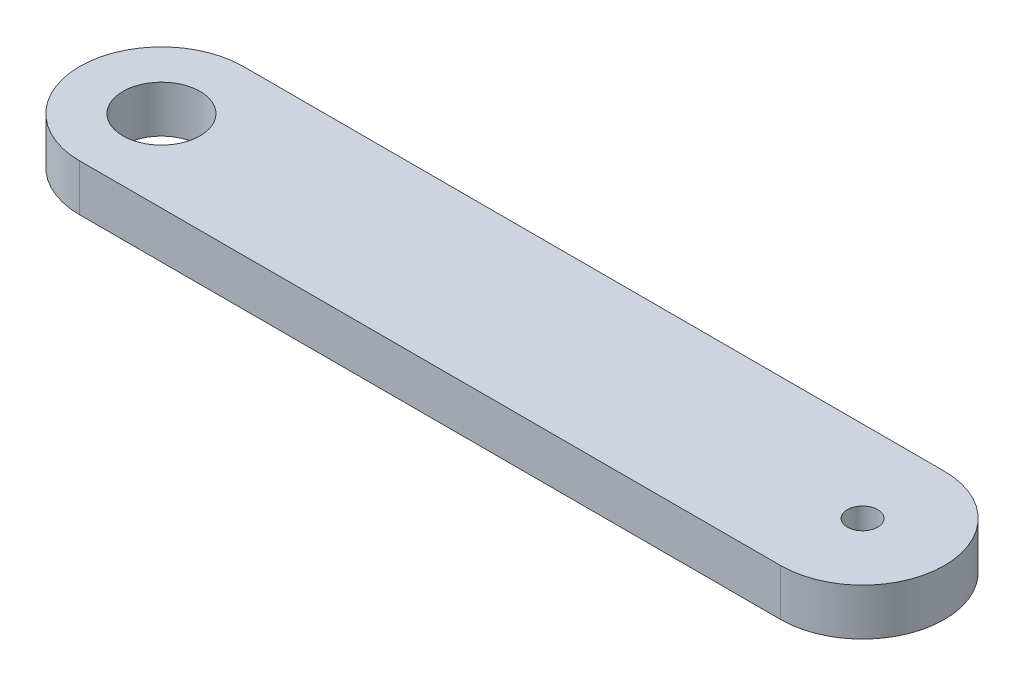
ISO-10303-21;
HEADER;
FILE_DESCRIPTION(('STEP AP214'),'2;1');
FILE_NAME('part.step','',(''),(''),'','','');
FILE_SCHEMA(('AUTOMOTIVE_DESIGN { 1 0 10303 214 1 1 1 1 }'));
ENDSEC;
DATA;
#1=APPLICATION_CONTEXT('core data for automotive mechanical design processes');
#2=APPLICATION_PROTOCOL_DEFINITION('international standard','automotive_design',2000,#1);
#3=PRODUCT_CONTEXT('',#1,'mechanical');
#4=PRODUCT('Part','Part','',(#3));
#5=PRODUCT_RELATED_PRODUCT_CATEGORY('part','',(#4));
#6=PRODUCT_DEFINITION_FORMATION('','',#4);
#7=PRODUCT_DEFINITION_CONTEXT('part definition',#1,'design');
#8=PRODUCT_DEFINITION('design','',#6,#7);
#9=PRODUCT_DEFINITION_SHAPE('','',#8);
#10=(LENGTH_UNIT() NAMED_UNIT(*) SI_UNIT(.MILLI.,.METRE.));
#11=(NAMED_UNIT(*) PLANE_ANGLE_UNIT() SI_UNIT($,.RADIAN.));
#12=(NAMED_UNIT(*) SI_UNIT($,.STERADIAN.) SOLID_ANGLE_UNIT());
#13=UNCERTAINTY_MEASURE_WITH_UNIT(LENGTH_MEASURE(1.E-05),#10,'distance_accuracy_value','');
#14=(GEOMETRIC_REPRESENTATION_CONTEXT(3) GLOBAL_UNCERTAINTY_ASSIGNED_CONTEXT((#13)) GLOBAL_UNIT_ASSIGNED_CONTEXT((#10,
#11,#12)) REPRESENTATION_CONTEXT('',''));
#15=CARTESIAN_POINT('',(0.,0.,0.));
#16=DIRECTION('',(0.,0.,1.));
#17=DIRECTION('',(1.,0.,0.));
#18=AXIS2_PLACEMENT_3D('',#15,#16,#17);
#19=CARTESIAN_POINT('',(0.,10.,0.));
#20=DIRECTION('',(0.,1.,0.));
#21=DIRECTION('',(0.,0.,1.));
#22=AXIS2_PLACEMENT_3D('',#19,#20,#21);
#23=PLANE('',#22);
#24=CARTESIAN_POINT('',(0.,10.,0.));
#25=DIRECTION('',(0.,1.,0.));
#26=DIRECTION('',(0.,0.,1.));
#27=AXIS2_PLACEMENT_3D('',#24,#25,#26);
#28=CIRCLE('',#27,8.25);
#29=CARTESIAN_POINT('',(0.,10.,8.25));
#30=VERTEX_POINT('',#29);
#31=EDGE_CURVE('E103',#30,#30,#28,.T.);
#32=ORIENTED_EDGE('',*,*,#31,.F.);
#33=EDGE_LOOP('',(#32));
#34=FACE_BOUND('',#33,.T.);
#35=CARTESIAN_POINT('',(0.,10.,0.));
#36=DIRECTION('',(0.,1.,0.));
#37=DIRECTION('',(0.,0.,1.));
#38=AXIS2_PLACEMENT_3D('',#35,#36,#37);
#39=CIRCLE('',#38,17.5);
#40=CARTESIAN_POINT('',(0.,10.,-17.5));
#41=VERTEX_POINT('',#40);
#42=CARTESIAN_POINT('',(0.,10.,17.5));
#43=VERTEX_POINT('',#42);
#44=EDGE_CURVE('E88',#41,#43,#39,.T.);
#45=ORIENTED_EDGE('',*,*,#44,.T.);
#46=DIRECTION('',(1.,0.,0.));
#47=VECTOR('',#46,1.);
#48=CARTESIAN_POINT('',(0.,10.,17.5));
#49=LINE('',#48,#47);
#50=CARTESIAN_POINT('',(150.,10.,17.5));
#51=VERTEX_POINT('',#50);
#52=EDGE_CURVE('E83',#43,#51,#49,.T.);
#53=ORIENTED_EDGE('',*,*,#52,.T.);
#54=CARTESIAN_POINT('',(150.,10.,0.));
#55=DIRECTION('',(0.,1.,0.));
#56=DIRECTION('',(0.,0.,1.));
#57=AXIS2_PLACEMENT_3D('',#54,#55,#56);
#58=CIRCLE('',#57,17.5);
#59=CARTESIAN_POINT('',(150.,10.,-17.5));
#60=VERTEX_POINT('',#59);
#61=EDGE_CURVE('E86',#51,#60,#58,.T.);
#62=ORIENTED_EDGE('',*,*,#61,.T.);
#63=DIRECTION('',(-1.,0.,0.));
#64=VECTOR('',#63,1.);
#65=CARTESIAN_POINT('',(0.,10.,-17.5));
#66=LINE('',#65,#64);
#67=EDGE_CURVE('E53',#60,#41,#66,.T.);
#68=ORIENTED_EDGE('',*,*,#67,.T.);
#69=EDGE_LOOP('',(#45,#53,#62,#68));
#70=FACE_BOUND('',#69,.T.);
#71=CARTESIAN_POINT('',(150.,10.,0.));
#72=DIRECTION('',(0.,1.,0.));
#73=DIRECTION('',(0.,0.,1.));
#74=AXIS2_PLACEMENT_3D('',#71,#72,#73);
#75=CIRCLE('',#74,3.25000000000001);
#76=CARTESIAN_POINT('',(150.,10.,3.25000000000001));
#77=VERTEX_POINT('',#76);
#78=EDGE_CURVE('E118',#77,#77,#75,.T.);
#79=ORIENTED_EDGE('',*,*,#78,.F.);
#80=EDGE_LOOP('',(#79));
#81=FACE_BOUND('',#80,.T.);
#82=ADVANCED_FACE('F36',(#34,#70,#81),#23,.T.);
#83=CARTESIAN_POINT('',(0.,0.,0.));
#84=DIRECTION('',(0.,1.,0.));
#85=DIRECTION('',(0.,0.,1.));
#86=AXIS2_PLACEMENT_3D('',#83,#84,#85);
#87=PLANE('',#86);
#88=CARTESIAN_POINT('',(0.,0.,0.));
#89=DIRECTION('',(0.,1.,0.));
#90=DIRECTION('',(0.,0.,1.));
#91=AXIS2_PLACEMENT_3D('',#88,#89,#90);
#92=CIRCLE('',#91,17.5);
#93=CARTESIAN_POINT('',(0.,0.,-17.5));
#94=VERTEX_POINT('',#93);
#95=CARTESIAN_POINT('',(0.,0.,17.5));
#96=VERTEX_POINT('',#95);
#97=EDGE_CURVE('E100',#94,#96,#92,.T.);
#98=ORIENTED_EDGE('',*,*,#97,.F.);
#99=DIRECTION('',(-1.,0.,0.));
#100=VECTOR('',#99,1.);
#101=CARTESIAN_POINT('',(0.,0.,-17.5));
#102=LINE('',#101,#100);
#103=CARTESIAN_POINT('',(150.,0.,-17.5));
#104=VERTEX_POINT('',#103);
#105=EDGE_CURVE('E76',#104,#94,#102,.T.);
#106=ORIENTED_EDGE('',*,*,#105,.F.);
#107=CARTESIAN_POINT('',(150.,0.,0.));
#108=DIRECTION('',(0.,1.,0.));
#109=DIRECTION('',(0.,0.,1.));
#110=AXIS2_PLACEMENT_3D('',#107,#108,#109);
#111=CIRCLE('',#110,17.5);
#112=CARTESIAN_POINT('',(150.,0.,17.5));
#113=VERTEX_POINT('',#112);
#114=EDGE_CURVE('E70',#113,#104,#111,.T.);
#115=ORIENTED_EDGE('',*,*,#114,.F.);
#116=DIRECTION('',(1.,0.,0.));
#117=VECTOR('',#116,1.);
#118=CARTESIAN_POINT('',(0.,0.,17.5));
#119=LINE('',#118,#117);
#120=EDGE_CURVE('E92',#96,#113,#119,.T.);
#121=ORIENTED_EDGE('',*,*,#120,.F.);
#122=EDGE_LOOP('',(#98,#106,#115,#121));
#123=FACE_BOUND('',#122,.T.);
#124=CARTESIAN_POINT('',(0.,0.,0.));
#125=DIRECTION('',(0.,1.,0.));
#126=DIRECTION('',(0.,0.,1.));
#127=AXIS2_PLACEMENT_3D('',#124,#125,#126);
#128=CIRCLE('',#127,8.25);
#129=CARTESIAN_POINT('',(0.,0.,8.25));
#130=VERTEX_POINT('',#129);
#131=EDGE_CURVE('E115',#130,#130,#128,.T.);
#132=ORIENTED_EDGE('',*,*,#131,.T.);
#133=EDGE_LOOP('',(#132));
#134=FACE_BOUND('',#133,.T.);
#135=CARTESIAN_POINT('',(150.,0.,0.));
#136=DIRECTION('',(0.,1.,0.));
#137=DIRECTION('',(0.,0.,1.));
#138=AXIS2_PLACEMENT_3D('',#135,#136,#137);
#139=CIRCLE('',#138,3.25000000000001);
#140=CARTESIAN_POINT('',(150.,0.,3.25000000000001));
#141=VERTEX_POINT('',#140);
#142=EDGE_CURVE('E121',#141,#141,#139,.T.);
#143=ORIENTED_EDGE('',*,*,#142,.T.);
#144=EDGE_LOOP('',(#143));
#145=FACE_BOUND('',#144,.T.);
#146=ADVANCED_FACE('F111',(#123,#134,#145),#87,.F.);
#147=CARTESIAN_POINT('',(0.,10.,0.));
#148=DIRECTION('',(0.,-1.,0.));
#149=DIRECTION('',(0.,0.,-1.));
#150=AXIS2_PLACEMENT_3D('',#147,#148,#149);
#151=CYLINDRICAL_SURFACE('',#150,17.5);
#152=ORIENTED_EDGE('',*,*,#97,.T.);
#153=DIRECTION('',(0.,-1.,0.));
#154=VECTOR('',#153,1.);
#155=CARTESIAN_POINT('',(0.,10.,17.5));
#156=LINE('',#155,#154);
#157=EDGE_CURVE('E11',#43,#96,#156,.T.);
#158=ORIENTED_EDGE('',*,*,#157,.F.);
#159=ORIENTED_EDGE('',*,*,#44,.F.);
#160=DIRECTION('',(0.,-1.,0.));
#161=VECTOR('',#160,1.);
#162=CARTESIAN_POINT('',(0.,10.,-17.5));
#163=LINE('',#162,#161);
#164=EDGE_CURVE('E96',#41,#94,#163,.T.);
#165=ORIENTED_EDGE('',*,*,#164,.T.);
#166=EDGE_LOOP('',(#152,#158,#159,#165));
#167=FACE_BOUND('',#166,.T.);
#168=ADVANCED_FACE('F38',(#167),#151,.T.);
#169=CARTESIAN_POINT('',(0.,10.,17.5));
#170=DIRECTION('',(0.,0.,-1.));
#171=DIRECTION('',(-1.,0.,0.));
#172=AXIS2_PLACEMENT_3D('',#169,#170,#171);
#173=PLANE('',#172);
#174=ORIENTED_EDGE('',*,*,#120,.T.);
#175=DIRECTION('',(0.,-1.,0.));
#176=VECTOR('',#175,1.);
#177=CARTESIAN_POINT('',(150.,10.,17.5));
#178=LINE('',#177,#176);
#179=EDGE_CURVE('E45',#51,#113,#178,.T.);
#180=ORIENTED_EDGE('',*,*,#179,.F.);
#181=ORIENTED_EDGE('',*,*,#52,.F.);
#182=ORIENTED_EDGE('',*,*,#157,.T.);
#183=EDGE_LOOP('',(#174,#180,#181,#182));
#184=FACE_BOUND('',#183,.T.);
#185=ADVANCED_FACE('F91',(#184),#173,.F.);
#186=CARTESIAN_POINT('',(150.,10.,0.));
#187=DIRECTION('',(0.,-1.,0.));
#188=DIRECTION('',(0.,0.,-1.));
#189=AXIS2_PLACEMENT_3D('',#186,#187,#188);
#190=CYLINDRICAL_SURFACE('',#189,17.5);
#191=ORIENTED_EDGE('',*,*,#114,.T.);
#192=DIRECTION('',(0.,-1.,0.));
#193=VECTOR('',#192,1.);
#194=CARTESIAN_POINT('',(150.,10.,-17.5));
#195=LINE('',#194,#193);
#196=EDGE_CURVE('E93',#60,#104,#195,.T.);
#197=ORIENTED_EDGE('',*,*,#196,.F.);
#198=ORIENTED_EDGE('',*,*,#61,.F.);
#199=ORIENTED_EDGE('',*,*,#179,.T.);
#200=EDGE_LOOP('',(#191,#197,#198,#199));
#201=FACE_BOUND('',#200,.T.);
#202=ADVANCED_FACE('F94',(#201),#190,.T.);
#203=CARTESIAN_POINT('',(0.,10.,-17.5));
#204=DIRECTION('',(0.,0.,1.));
#205=DIRECTION('',(1.,0.,0.));
#206=AXIS2_PLACEMENT_3D('',#203,#204,#205);
#207=PLANE('',#206);
#208=ORIENTED_EDGE('',*,*,#105,.T.);
#209=ORIENTED_EDGE('',*,*,#164,.F.);
#210=ORIENTED_EDGE('',*,*,#67,.F.);
#211=ORIENTED_EDGE('',*,*,#196,.T.);
#212=EDGE_LOOP('',(#208,#209,#210,#211));
#213=FACE_BOUND('',#212,.T.);
#214=ADVANCED_FACE('F108',(#213),#207,.F.);
#215=CARTESIAN_POINT('',(0.,10.,0.));
#216=DIRECTION('',(0.,-1.,0.));
#217=DIRECTION('',(0.,0.,-1.));
#218=AXIS2_PLACEMENT_3D('',#215,#216,#217);
#219=CYLINDRICAL_SURFACE('',#218,8.25);
#220=ORIENTED_EDGE('',*,*,#31,.T.);
#221=EDGE_LOOP('',(#220));
#222=FACE_BOUND('',#221,.T.);
#223=ORIENTED_EDGE('',*,*,#131,.F.);
#224=EDGE_LOOP('',(#223));
#225=FACE_BOUND('',#224,.T.);
#226=ADVANCED_FACE('F138',(#222,#225),#219,.F.);
#227=CARTESIAN_POINT('',(150.,10.,0.));
#228=DIRECTION('',(0.,-1.,0.));
#229=DIRECTION('',(0.,0.,-1.));
#230=AXIS2_PLACEMENT_3D('',#227,#228,#229);
#231=CYLINDRICAL_SURFACE('',#230,3.25000000000001);
#232=ORIENTED_EDGE('',*,*,#78,.T.);
#233=EDGE_LOOP('',(#232));
#234=FACE_BOUND('',#233,.T.);
#235=ORIENTED_EDGE('',*,*,#142,.F.);
#236=EDGE_LOOP('',(#235));
#237=FACE_BOUND('',#236,.T.);
#238=ADVANCED_FACE('F127',(#234,#237),#231,.F.);
#239=CLOSED_SHELL('',(#82,#146,#168,#185,#202,#214,#226,#238));
#240=MANIFOLD_SOLID_BREP('B2',#239);
#241=ADVANCED_BREP_SHAPE_REPRESENTATION('',(#18,#240),#14);
#242=SHAPE_DEFINITION_REPRESENTATION(#9,#241);
ENDSEC;
END-ISO-10303-21;
